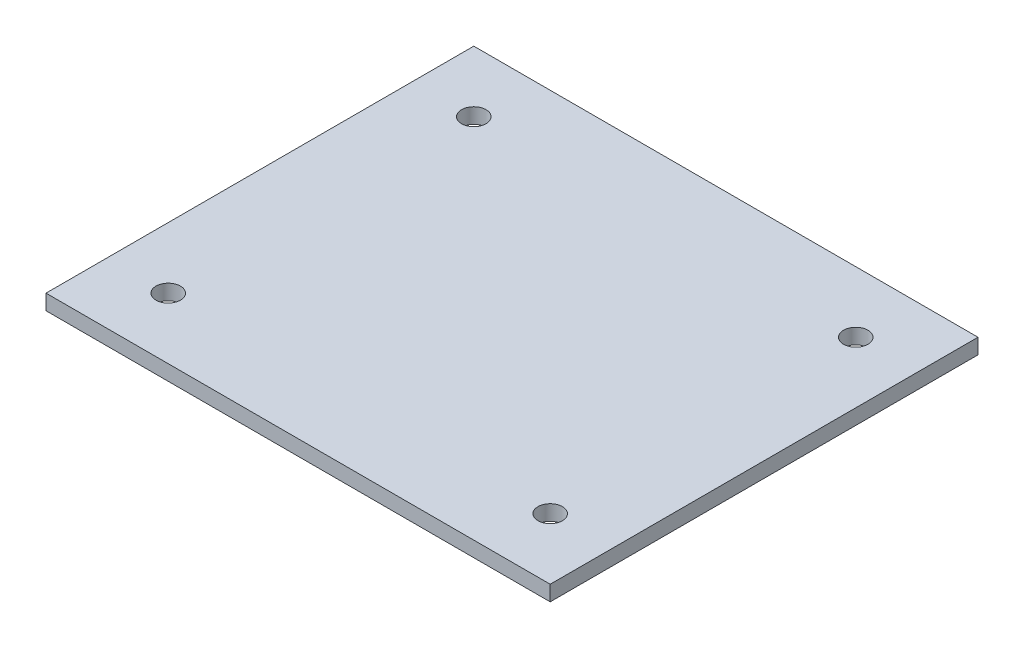
ISO-10303-21;
HEADER;
FILE_DESCRIPTION(('STEP AP214'),'2;1');
FILE_NAME('part.step','',(''),(''),'','','');
FILE_SCHEMA(('AUTOMOTIVE_DESIGN { 1 0 10303 214 1 1 1 1 }'));
ENDSEC;
DATA;
#1=APPLICATION_CONTEXT('core data for automotive mechanical design processes');
#2=APPLICATION_PROTOCOL_DEFINITION('international standard','automotive_design',2000,#1);
#3=PRODUCT_CONTEXT('',#1,'mechanical');
#4=PRODUCT('Part','Part','',(#3));
#5=PRODUCT_RELATED_PRODUCT_CATEGORY('part','',(#4));
#6=PRODUCT_DEFINITION_FORMATION('','',#4);
#7=PRODUCT_DEFINITION_CONTEXT('part definition',#1,'design');
#8=PRODUCT_DEFINITION('design','',#6,#7);
#9=PRODUCT_DEFINITION_SHAPE('','',#8);
#10=(LENGTH_UNIT() NAMED_UNIT(*) SI_UNIT(.MILLI.,.METRE.));
#11=(NAMED_UNIT(*) PLANE_ANGLE_UNIT() SI_UNIT($,.RADIAN.));
#12=(NAMED_UNIT(*) SI_UNIT($,.STERADIAN.) SOLID_ANGLE_UNIT());
#13=UNCERTAINTY_MEASURE_WITH_UNIT(LENGTH_MEASURE(1.E-05),#10,'distance_accuracy_value','');
#14=(GEOMETRIC_REPRESENTATION_CONTEXT(3) GLOBAL_UNCERTAINTY_ASSIGNED_CONTEXT((#13)) GLOBAL_UNIT_ASSIGNED_CONTEXT((#10,
#11,#12)) REPRESENTATION_CONTEXT('',''));
#15=CARTESIAN_POINT('',(0.,0.,0.));
#16=DIRECTION('',(0.,0.,1.));
#17=DIRECTION('',(1.,0.,0.));
#18=AXIS2_PLACEMENT_3D('',#15,#16,#17);
#19=CARTESIAN_POINT('',(25.,0.,20.));
#20=DIRECTION('',(0.,1.,0.));
#21=DIRECTION('',(0.,0.,1.));
#22=AXIS2_PLACEMENT_3D('',#19,#20,#21);
#23=CYLINDRICAL_SURFACE('',#22,1.6);
#24=CARTESIAN_POINT('',(25.,0.,20.));
#25=DIRECTION('',(0.,1.,0.));
#26=DIRECTION('',(0.,0.,1.));
#27=AXIS2_PLACEMENT_3D('',#24,#25,#26);
#28=CIRCLE('',#27,1.6);
#29=CARTESIAN_POINT('',(25.,0.,21.6));
#30=VERTEX_POINT('',#29);
#31=EDGE_CURVE('E43',#30,#30,#28,.T.);
#32=ORIENTED_EDGE('',*,*,#31,.F.);
#33=EDGE_LOOP('',(#32));
#34=FACE_BOUND('',#33,.T.);
#35=CARTESIAN_POINT('',(25.,2.,20.));
#36=DIRECTION('',(0.,1.,0.));
#37=DIRECTION('',(0.,0.,1.));
#38=AXIS2_PLACEMENT_3D('',#35,#36,#37);
#39=CIRCLE('',#38,1.6);
#40=CARTESIAN_POINT('',(25.,2.,21.6));
#41=VERTEX_POINT('',#40);
#42=EDGE_CURVE('E11',#41,#41,#39,.T.);
#43=ORIENTED_EDGE('',*,*,#42,.T.);
#44=EDGE_LOOP('',(#43));
#45=FACE_BOUND('',#44,.T.);
#46=ADVANCED_FACE('F35',(#34,#45),#23,.F.);
#47=CARTESIAN_POINT('',(-25.,0.,20.));
#48=DIRECTION('',(0.,1.,0.));
#49=DIRECTION('',(0.,0.,1.));
#50=AXIS2_PLACEMENT_3D('',#47,#48,#49);
#51=CYLINDRICAL_SURFACE('',#50,1.6);
#52=CARTESIAN_POINT('',(-25.,0.,20.));
#53=DIRECTION('',(0.,1.,0.));
#54=DIRECTION('',(0.,0.,1.));
#55=AXIS2_PLACEMENT_3D('',#52,#53,#54);
#56=CIRCLE('',#55,1.6);
#57=CARTESIAN_POINT('',(-25.,0.,21.6));
#58=VERTEX_POINT('',#57);
#59=EDGE_CURVE('E113',#58,#58,#56,.T.);
#60=ORIENTED_EDGE('',*,*,#59,.F.);
#61=EDGE_LOOP('',(#60));
#62=FACE_BOUND('',#61,.T.);
#63=CARTESIAN_POINT('',(-25.,2.,20.));
#64=DIRECTION('',(0.,1.,0.));
#65=DIRECTION('',(0.,0.,1.));
#66=AXIS2_PLACEMENT_3D('',#63,#64,#65);
#67=CIRCLE('',#66,1.6);
#68=CARTESIAN_POINT('',(-25.,2.,21.6));
#69=VERTEX_POINT('',#68);
#70=EDGE_CURVE('E116',#69,#69,#67,.T.);
#71=ORIENTED_EDGE('',*,*,#70,.T.);
#72=EDGE_LOOP('',(#71));
#73=FACE_BOUND('',#72,.T.);
#74=ADVANCED_FACE('F125',(#62,#73),#51,.F.);
#75=CARTESIAN_POINT('',(-33.,2.,28.));
#76=DIRECTION('',(1.,0.,0.));
#77=DIRECTION('',(0.,0.,-1.));
#78=AXIS2_PLACEMENT_3D('',#75,#76,#77);
#79=PLANE('',#78);
#80=DIRECTION('',(0.,0.,1.));
#81=VECTOR('',#80,1.);
#82=CARTESIAN_POINT('',(-33.,0.,28.));
#83=LINE('',#82,#81);
#84=CARTESIAN_POINT('',(-33.,0.,-28.));
#85=VERTEX_POINT('',#84);
#86=CARTESIAN_POINT('',(-33.,0.,28.));
#87=VERTEX_POINT('',#86);
#88=EDGE_CURVE('E103',#85,#87,#83,.T.);
#89=ORIENTED_EDGE('',*,*,#88,.T.);
#90=DIRECTION('',(0.,-1.,0.));
#91=VECTOR('',#90,1.);
#92=CARTESIAN_POINT('',(-33.,2.,28.));
#93=LINE('',#92,#91);
#94=CARTESIAN_POINT('',(-33.,2.,28.));
#95=VERTEX_POINT('',#94);
#96=EDGE_CURVE('E94',#95,#87,#93,.T.);
#97=ORIENTED_EDGE('',*,*,#96,.F.);
#98=DIRECTION('',(0.,0.,1.));
#99=VECTOR('',#98,1.);
#100=CARTESIAN_POINT('',(-33.,2.,28.));
#101=LINE('',#100,#99);
#102=CARTESIAN_POINT('',(-33.,2.,-28.));
#103=VERTEX_POINT('',#102);
#104=EDGE_CURVE('E88',#103,#95,#101,.T.);
#105=ORIENTED_EDGE('',*,*,#104,.F.);
#106=DIRECTION('',(0.,-1.,0.));
#107=VECTOR('',#106,1.);
#108=CARTESIAN_POINT('',(-33.,2.,-28.));
#109=LINE('',#108,#107);
#110=EDGE_CURVE('E99',#103,#85,#109,.T.);
#111=ORIENTED_EDGE('',*,*,#110,.T.);
#112=EDGE_LOOP('',(#89,#97,#105,#111));
#113=FACE_BOUND('',#112,.T.);
#114=ADVANCED_FACE('F149',(#113),#79,.F.);
#115=CARTESIAN_POINT('',(33.,2.,28.));
#116=DIRECTION('',(0.,0.,-1.));
#117=DIRECTION('',(-1.,0.,0.));
#118=AXIS2_PLACEMENT_3D('',#115,#116,#117);
#119=PLANE('',#118);
#120=DIRECTION('',(1.,0.,0.));
#121=VECTOR('',#120,1.);
#122=CARTESIAN_POINT('',(33.,0.,28.));
#123=LINE('',#122,#121);
#124=CARTESIAN_POINT('',(33.,0.,28.));
#125=VERTEX_POINT('',#124);
#126=EDGE_CURVE('E93',#87,#125,#123,.T.);
#127=ORIENTED_EDGE('',*,*,#126,.T.);
#128=DIRECTION('',(0.,-1.,0.));
#129=VECTOR('',#128,1.);
#130=CARTESIAN_POINT('',(33.,2.,28.));
#131=LINE('',#130,#129);
#132=CARTESIAN_POINT('',(33.,2.,28.));
#133=VERTEX_POINT('',#132);
#134=EDGE_CURVE('E91',#133,#125,#131,.T.);
#135=ORIENTED_EDGE('',*,*,#134,.F.);
#136=DIRECTION('',(1.,0.,0.));
#137=VECTOR('',#136,1.);
#138=CARTESIAN_POINT('',(33.,2.,28.));
#139=LINE('',#138,#137);
#140=EDGE_CURVE('E82',#95,#133,#139,.T.);
#141=ORIENTED_EDGE('',*,*,#140,.F.);
#142=ORIENTED_EDGE('',*,*,#96,.T.);
#143=EDGE_LOOP('',(#127,#135,#141,#142));
#144=FACE_BOUND('',#143,.T.);
#145=ADVANCED_FACE('F92',(#144),#119,.F.);
#146=CARTESIAN_POINT('',(33.,2.,28.));
#147=DIRECTION('',(-1.,0.,0.));
#148=DIRECTION('',(0.,0.,1.));
#149=AXIS2_PLACEMENT_3D('',#146,#147,#148);
#150=PLANE('',#149);
#151=DIRECTION('',(0.,0.,-1.));
#152=VECTOR('',#151,1.);
#153=CARTESIAN_POINT('',(33.,0.,28.));
#154=LINE('',#153,#152);
#155=CARTESIAN_POINT('',(33.,0.,-28.));
#156=VERTEX_POINT('',#155);
#157=EDGE_CURVE('E68',#125,#156,#154,.T.);
#158=ORIENTED_EDGE('',*,*,#157,.T.);
#159=DIRECTION('',(0.,-1.,0.));
#160=VECTOR('',#159,1.);
#161=CARTESIAN_POINT('',(33.,2.,-28.));
#162=LINE('',#161,#160);
#163=CARTESIAN_POINT('',(33.,2.,-28.));
#164=VERTEX_POINT('',#163);
#165=EDGE_CURVE('E95',#164,#156,#162,.T.);
#166=ORIENTED_EDGE('',*,*,#165,.F.);
#167=DIRECTION('',(0.,0.,-1.));
#168=VECTOR('',#167,1.);
#169=CARTESIAN_POINT('',(33.,2.,28.));
#170=LINE('',#169,#168);
#171=EDGE_CURVE('E86',#133,#164,#170,.T.);
#172=ORIENTED_EDGE('',*,*,#171,.F.);
#173=ORIENTED_EDGE('',*,*,#134,.T.);
#174=EDGE_LOOP('',(#158,#166,#172,#173));
#175=FACE_BOUND('',#174,.T.);
#176=ADVANCED_FACE('F97',(#175),#150,.F.);
#177=CARTESIAN_POINT('',(33.,2.,-28.));
#178=DIRECTION('',(0.,0.,1.));
#179=DIRECTION('',(1.,0.,0.));
#180=AXIS2_PLACEMENT_3D('',#177,#178,#179);
#181=PLANE('',#180);
#182=DIRECTION('',(-1.,0.,0.));
#183=VECTOR('',#182,1.);
#184=CARTESIAN_POINT('',(33.,0.,-28.));
#185=LINE('',#184,#183);
#186=EDGE_CURVE('E74',#156,#85,#185,.T.);
#187=ORIENTED_EDGE('',*,*,#186,.T.);
#188=ORIENTED_EDGE('',*,*,#110,.F.);
#189=DIRECTION('',(-1.,0.,0.));
#190=VECTOR('',#189,1.);
#191=CARTESIAN_POINT('',(33.,2.,-28.));
#192=LINE('',#191,#190);
#193=EDGE_CURVE('E51',#164,#103,#192,.T.);
#194=ORIENTED_EDGE('',*,*,#193,.F.);
#195=ORIENTED_EDGE('',*,*,#165,.T.);
#196=EDGE_LOOP('',(#187,#188,#194,#195));
#197=FACE_BOUND('',#196,.T.);
#198=ADVANCED_FACE('F129',(#197),#181,.F.);
#199=CARTESIAN_POINT('',(0.,2.,0.));
#200=DIRECTION('',(0.,1.,0.));
#201=DIRECTION('',(0.,0.,1.));
#202=AXIS2_PLACEMENT_3D('',#199,#200,#201);
#203=PLANE('',#202);
#204=CARTESIAN_POINT('',(25.,2.,-20.));
#205=DIRECTION('',(0.,1.,0.));
#206=DIRECTION('',(0.,0.,1.));
#207=AXIS2_PLACEMENT_3D('',#204,#205,#206);
#208=CIRCLE('',#207,1.6);
#209=CARTESIAN_POINT('',(25.,2.,-18.4));
#210=VERTEX_POINT('',#209);
#211=EDGE_CURVE('E220',#210,#210,#208,.T.);
#212=ORIENTED_EDGE('',*,*,#211,.F.);
#213=EDGE_LOOP('',(#212));
#214=FACE_BOUND('',#213,.T.);
#215=CARTESIAN_POINT('',(-25.,2.,-20.));
#216=DIRECTION('',(0.,1.,0.));
#217=DIRECTION('',(0.,0.,1.));
#218=AXIS2_PLACEMENT_3D('',#215,#216,#217);
#219=CIRCLE('',#218,1.6);
#220=CARTESIAN_POINT('',(-25.,2.,-18.4));
#221=VERTEX_POINT('',#220);
#222=EDGE_CURVE('E221',#221,#221,#219,.T.);
#223=ORIENTED_EDGE('',*,*,#222,.F.);
#224=EDGE_LOOP('',(#223));
#225=FACE_BOUND('',#224,.T.);
#226=ORIENTED_EDGE('',*,*,#104,.T.);
#227=ORIENTED_EDGE('',*,*,#140,.T.);
#228=ORIENTED_EDGE('',*,*,#171,.T.);
#229=ORIENTED_EDGE('',*,*,#193,.T.);
#230=EDGE_LOOP('',(#226,#227,#228,#229));
#231=FACE_BOUND('',#230,.T.);
#232=ORIENTED_EDGE('',*,*,#70,.F.);
#233=EDGE_LOOP('',(#232));
#234=FACE_BOUND('',#233,.T.);
#235=ORIENTED_EDGE('',*,*,#42,.F.);
#236=EDGE_LOOP('',(#235));
#237=FACE_BOUND('',#236,.T.);
#238=ADVANCED_FACE('F83',(#214,#225,#231,#234,#237),#203,.T.);
#239=CARTESIAN_POINT('',(0.,0.,0.));
#240=DIRECTION('',(0.,1.,0.));
#241=DIRECTION('',(0.,0.,1.));
#242=AXIS2_PLACEMENT_3D('',#239,#240,#241);
#243=PLANE('',#242);
#244=CARTESIAN_POINT('',(25.,0.,-20.));
#245=DIRECTION('',(0.,1.,0.));
#246=DIRECTION('',(0.,0.,1.));
#247=AXIS2_PLACEMENT_3D('',#244,#245,#246);
#248=CIRCLE('',#247,1.6);
#249=CARTESIAN_POINT('',(25.,0.,-18.4));
#250=VERTEX_POINT('',#249);
#251=EDGE_CURVE('E218',#250,#250,#248,.T.);
#252=ORIENTED_EDGE('',*,*,#251,.T.);
#253=EDGE_LOOP('',(#252));
#254=FACE_BOUND('',#253,.T.);
#255=CARTESIAN_POINT('',(-25.,0.,-20.));
#256=DIRECTION('',(0.,1.,0.));
#257=DIRECTION('',(0.,0.,1.));
#258=AXIS2_PLACEMENT_3D('',#255,#256,#257);
#259=CIRCLE('',#258,1.6);
#260=CARTESIAN_POINT('',(-25.,0.,-18.4));
#261=VERTEX_POINT('',#260);
#262=EDGE_CURVE('E106',#261,#261,#259,.T.);
#263=ORIENTED_EDGE('',*,*,#262,.T.);
#264=EDGE_LOOP('',(#263));
#265=FACE_BOUND('',#264,.T.);
#266=ORIENTED_EDGE('',*,*,#88,.F.);
#267=ORIENTED_EDGE('',*,*,#186,.F.);
#268=ORIENTED_EDGE('',*,*,#157,.F.);
#269=ORIENTED_EDGE('',*,*,#126,.F.);
#270=EDGE_LOOP('',(#266,#267,#268,#269));
#271=FACE_BOUND('',#270,.T.);
#272=ORIENTED_EDGE('',*,*,#59,.T.);
#273=EDGE_LOOP('',(#272));
#274=FACE_BOUND('',#273,.T.);
#275=ORIENTED_EDGE('',*,*,#31,.T.);
#276=EDGE_LOOP('',(#275));
#277=FACE_BOUND('',#276,.T.);
#278=ADVANCED_FACE('F121',(#254,#265,#271,#274,#277),#243,.F.);
#279=CARTESIAN_POINT('',(-25.,0.,-20.));
#280=DIRECTION('',(0.,1.,0.));
#281=DIRECTION('',(0.,0.,1.));
#282=AXIS2_PLACEMENT_3D('',#279,#280,#281);
#283=CYLINDRICAL_SURFACE('',#282,1.6);
#284=ORIENTED_EDGE('',*,*,#262,.F.);
#285=EDGE_LOOP('',(#284));
#286=FACE_BOUND('',#285,.T.);
#287=ORIENTED_EDGE('',*,*,#222,.T.);
#288=EDGE_LOOP('',(#287));
#289=FACE_BOUND('',#288,.T.);
#290=ADVANCED_FACE('F136',(#286,#289),#283,.F.);
#291=CARTESIAN_POINT('',(25.,0.,-20.));
#292=DIRECTION('',(0.,1.,0.));
#293=DIRECTION('',(0.,0.,1.));
#294=AXIS2_PLACEMENT_3D('',#291,#292,#293);
#295=CYLINDRICAL_SURFACE('',#294,1.6);
#296=ORIENTED_EDGE('',*,*,#251,.F.);
#297=EDGE_LOOP('',(#296));
#298=FACE_BOUND('',#297,.T.);
#299=ORIENTED_EDGE('',*,*,#211,.T.);
#300=EDGE_LOOP('',(#299));
#301=FACE_BOUND('',#300,.T.);
#302=ADVANCED_FACE('F187',(#298,#301),#295,.F.);
#303=CLOSED_SHELL('',(#46,#74,#114,#145,#176,#198,#238,#278,#290,#302));
#304=MANIFOLD_SOLID_BREP('B2',#303);
#305=ADVANCED_BREP_SHAPE_REPRESENTATION('',(#18,#304),#14);
#306=SHAPE_DEFINITION_REPRESENTATION(#9,#305);
ENDSEC;
END-ISO-10303-21;
